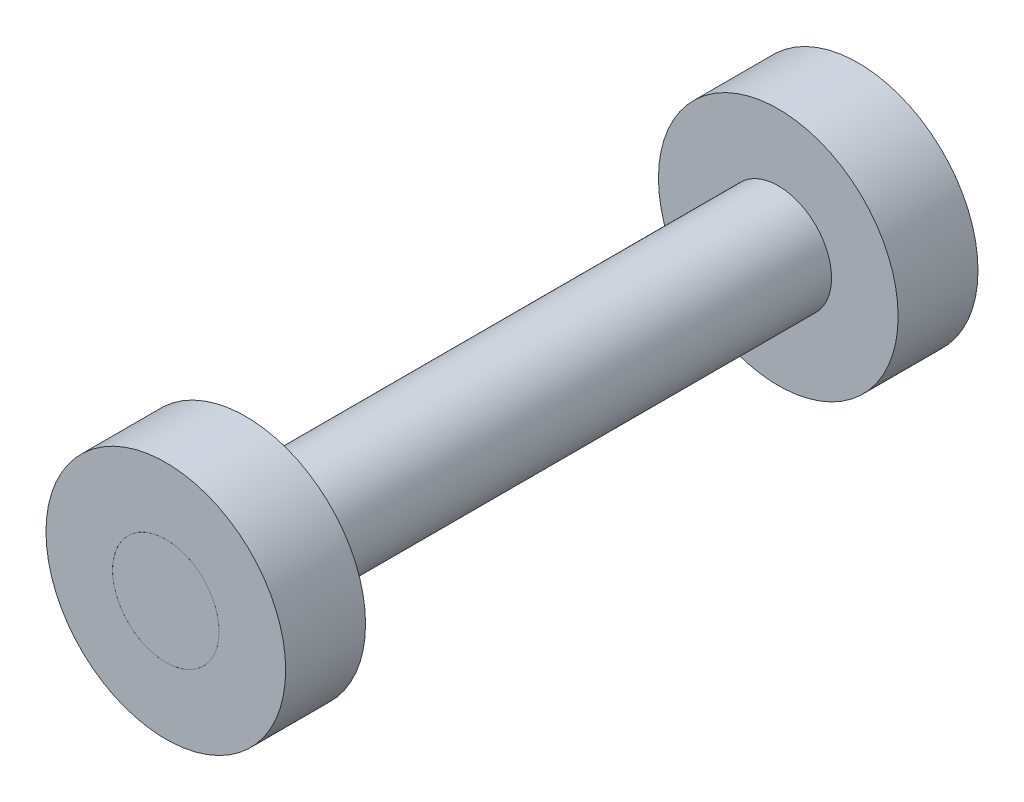
ISO-10303-21;
HEADER;
FILE_DESCRIPTION(('STEP AP214'),'2;1');
FILE_NAME('part.step','',(''),(''),'','','');
FILE_SCHEMA(('AUTOMOTIVE_DESIGN { 1 0 10303 214 1 1 1 1 }'));
ENDSEC;
DATA;
#1=APPLICATION_CONTEXT('core data for automotive mechanical design processes');
#2=APPLICATION_PROTOCOL_DEFINITION('international standard','automotive_design',2000,#1);
#3=PRODUCT_CONTEXT('',#1,'mechanical');
#4=PRODUCT('Part','Part','',(#3));
#5=PRODUCT_RELATED_PRODUCT_CATEGORY('part','',(#4));
#6=PRODUCT_DEFINITION_FORMATION('','',#4);
#7=PRODUCT_DEFINITION_CONTEXT('part definition',#1,'design');
#8=PRODUCT_DEFINITION('design','',#6,#7);
#9=PRODUCT_DEFINITION_SHAPE('','',#8);
#10=(LENGTH_UNIT() NAMED_UNIT(*) SI_UNIT(.MILLI.,.METRE.));
#11=(NAMED_UNIT(*) PLANE_ANGLE_UNIT() SI_UNIT($,.RADIAN.));
#12=(NAMED_UNIT(*) SI_UNIT($,.STERADIAN.) SOLID_ANGLE_UNIT());
#13=UNCERTAINTY_MEASURE_WITH_UNIT(LENGTH_MEASURE(1.E-05),#10,'distance_accuracy_value','');
#14=(GEOMETRIC_REPRESENTATION_CONTEXT(3) GLOBAL_UNCERTAINTY_ASSIGNED_CONTEXT((#13)) GLOBAL_UNIT_ASSIGNED_CONTEXT((#10,
#11,#12)) REPRESENTATION_CONTEXT('',''));
#15=CARTESIAN_POINT('',(0.,0.,0.));
#16=DIRECTION('',(0.,0.,1.));
#17=DIRECTION('',(1.,0.,0.));
#18=AXIS2_PLACEMENT_3D('',#15,#16,#17);
#19=CARTESIAN_POINT('',(0.,0.,26.));
#20=DIRECTION('',(0.,0.,1.));
#21=DIRECTION('',(1.,0.,0.));
#22=AXIS2_PLACEMENT_3D('',#19,#20,#21);
#23=PLANE('',#22);
#24=CARTESIAN_POINT('',(0.,0.,26.));
#25=DIRECTION('',(0.,0.,1.));
#26=DIRECTION('',(1.,0.,0.));
#27=AXIS2_PLACEMENT_3D('',#24,#25,#26);
#28=CIRCLE('',#27,4.5);
#29=CARTESIAN_POINT('',(4.5,0.,26.));
#30=VERTEX_POINT('',#29);
#31=EDGE_CURVE('E11',#30,#30,#28,.T.);
#32=ORIENTED_EDGE('',*,*,#31,.T.);
#33=EDGE_LOOP('',(#32));
#34=FACE_BOUND('',#33,.T.);
#35=CARTESIAN_POINT('',(0.,0.,26.));
#36=DIRECTION('',(0.,0.,1.));
#37=DIRECTION('',(1.,0.,0.));
#38=AXIS2_PLACEMENT_3D('',#35,#36,#37);
#39=CIRCLE('',#38,2.);
#40=CARTESIAN_POINT('',(2.,0.,26.));
#41=VERTEX_POINT('',#40);
#42=EDGE_CURVE('E56',#41,#41,#39,.T.);
#43=ORIENTED_EDGE('',*,*,#42,.F.);
#44=EDGE_LOOP('',(#43));
#45=FACE_BOUND('',#44,.T.);
#46=ADVANCED_FACE('F45',(#34,#45),#23,.T.);
#47=CARTESIAN_POINT('',(0.,0.,23.));
#48=DIRECTION('',(0.,0.,1.));
#49=DIRECTION('',(1.,0.,0.));
#50=AXIS2_PLACEMENT_3D('',#47,#48,#49);
#51=PLANE('',#50);
#52=CARTESIAN_POINT('',(0.,0.,23.));
#53=DIRECTION('',(0.,0.,1.));
#54=DIRECTION('',(1.,0.,0.));
#55=AXIS2_PLACEMENT_3D('',#52,#53,#54);
#56=CIRCLE('',#55,4.5);
#57=CARTESIAN_POINT('',(4.5,0.,23.));
#58=VERTEX_POINT('',#57);
#59=EDGE_CURVE('E49',#58,#58,#56,.T.);
#60=ORIENTED_EDGE('',*,*,#59,.F.);
#61=EDGE_LOOP('',(#60));
#62=FACE_BOUND('',#61,.T.);
#63=CARTESIAN_POINT('',(0.,0.,23.));
#64=DIRECTION('',(0.,0.,1.));
#65=DIRECTION('',(1.,0.,0.));
#66=AXIS2_PLACEMENT_3D('',#63,#64,#65);
#67=CIRCLE('',#66,2.);
#68=CARTESIAN_POINT('',(2.,0.,23.));
#69=VERTEX_POINT('',#68);
#70=EDGE_CURVE('E58',#69,#69,#67,.T.);
#71=ORIENTED_EDGE('',*,*,#70,.T.);
#72=EDGE_LOOP('',(#71));
#73=FACE_BOUND('',#72,.T.);
#74=ADVANCED_FACE('F68',(#62,#73),#51,.F.);
#75=CARTESIAN_POINT('',(0.,0.,26.));
#76=DIRECTION('',(0.,0.,-1.));
#77=DIRECTION('',(-1.,0.,0.));
#78=AXIS2_PLACEMENT_3D('',#75,#76,#77);
#79=CYLINDRICAL_SURFACE('',#78,4.5);
#80=ORIENTED_EDGE('',*,*,#31,.F.);
#81=EDGE_LOOP('',(#80));
#82=FACE_BOUND('',#81,.T.);
#83=ORIENTED_EDGE('',*,*,#59,.T.);
#84=EDGE_LOOP('',(#83));
#85=FACE_BOUND('',#84,.T.);
#86=ADVANCED_FACE('F47',(#82,#85),#79,.T.);
#87=CARTESIAN_POINT('',(0.,0.,26.));
#88=DIRECTION('',(0.,0.,-1.));
#89=DIRECTION('',(-1.,0.,0.));
#90=AXIS2_PLACEMENT_3D('',#87,#88,#89);
#91=CYLINDRICAL_SURFACE('',#90,2.);
#92=ORIENTED_EDGE('',*,*,#42,.T.);
#93=EDGE_LOOP('',(#92));
#94=FACE_BOUND('',#93,.T.);
#95=ORIENTED_EDGE('',*,*,#70,.F.);
#96=EDGE_LOOP('',(#95));
#97=FACE_BOUND('',#96,.T.);
#98=ADVANCED_FACE('F64',(#94,#97),#91,.F.);
#99=CLOSED_SHELL('',(#46,#74,#86,#98));
#100=MANIFOLD_SOLID_BREP('B2',#99);
#101=CARTESIAN_POINT('',(0.,0.,3.));
#102=DIRECTION('',(0.,0.,-1.));
#103=DIRECTION('',(-1.,0.,0.));
#104=AXIS2_PLACEMENT_3D('',#101,#102,#103);
#105=CYLINDRICAL_SURFACE('',#104,4.5);
#106=CARTESIAN_POINT('',(0.,0.,3.));
#107=DIRECTION('',(0.,0.,1.));
#108=DIRECTION('',(1.,0.,0.));
#109=AXIS2_PLACEMENT_3D('',#106,#107,#108);
#110=CIRCLE('',#109,4.5);
#111=CARTESIAN_POINT('',(4.5,0.,3.));
#112=VERTEX_POINT('',#111);
#113=EDGE_CURVE('E44',#112,#112,#110,.T.);
#114=ORIENTED_EDGE('',*,*,#113,.F.);
#115=EDGE_LOOP('',(#114));
#116=FACE_BOUND('',#115,.T.);
#117=CARTESIAN_POINT('',(0.,0.,0.));
#118=DIRECTION('',(0.,0.,1.));
#119=DIRECTION('',(1.,0.,0.));
#120=AXIS2_PLACEMENT_3D('',#117,#118,#119);
#121=CIRCLE('',#120,4.5);
#122=CARTESIAN_POINT('',(4.5,0.,0.));
#123=VERTEX_POINT('',#122);
#124=EDGE_CURVE('E110',#123,#123,#121,.T.);
#125=ORIENTED_EDGE('',*,*,#124,.T.);
#126=EDGE_LOOP('',(#125));
#127=FACE_BOUND('',#126,.T.);
#128=ADVANCED_FACE('F107',(#116,#127),#105,.T.);
#129=CARTESIAN_POINT('',(0.,0.,3.));
#130=DIRECTION('',(0.,0.,1.));
#131=DIRECTION('',(1.,0.,0.));
#132=AXIS2_PLACEMENT_3D('',#129,#130,#131);
#133=PLANE('',#132);
#134=CARTESIAN_POINT('',(0.,0.,3.));
#135=DIRECTION('',(0.,0.,1.));
#136=DIRECTION('',(1.,0.,0.));
#137=AXIS2_PLACEMENT_3D('',#134,#135,#136);
#138=CIRCLE('',#137,2.);
#139=CARTESIAN_POINT('',(-2.,0.,3.));
#140=VERTEX_POINT('',#139);
#141=EDGE_CURVE('E119',#140,#140,#138,.F.);
#142=ORIENTED_EDGE('',*,*,#141,.T.);
#143=EDGE_LOOP('',(#142));
#144=FACE_BOUND('',#143,.T.);
#145=ORIENTED_EDGE('',*,*,#113,.T.);
#146=EDGE_LOOP('',(#145));
#147=FACE_BOUND('',#146,.T.);
#148=ADVANCED_FACE('F141',(#144,#147),#133,.T.);
#149=CARTESIAN_POINT('',(0.,0.,0.));
#150=DIRECTION('',(0.,0.,1.));
#151=DIRECTION('',(1.,0.,0.));
#152=AXIS2_PLACEMENT_3D('',#149,#150,#151);
#153=PLANE('',#152);
#154=ORIENTED_EDGE('',*,*,#124,.F.);
#155=EDGE_LOOP('',(#154));
#156=FACE_BOUND('',#155,.T.);
#157=ADVANCED_FACE('F133',(#156),#153,.F.);
#158=CARTESIAN_POINT('',(0.,0.,26.));
#159=DIRECTION('',(0.,0.,-1.));
#160=DIRECTION('',(-1.,0.,0.));
#161=AXIS2_PLACEMENT_3D('',#158,#159,#160);
#162=CYLINDRICAL_SURFACE('',#161,2.);
#163=CARTESIAN_POINT('',(0.,0.,26.));
#164=DIRECTION('',(0.,0.,1.));
#165=DIRECTION('',(1.,0.,0.));
#166=AXIS2_PLACEMENT_3D('',#163,#164,#165);
#167=CIRCLE('',#166,2.);
#168=CARTESIAN_POINT('',(-2.,0.,26.));
#169=VERTEX_POINT('',#168);
#170=EDGE_CURVE('E124',#169,#169,#167,.T.);
#171=CARTESIAN_POINT('',(-2.,0.,3.));
#172=CARTESIAN_POINT('',(-2.,0.,3.23958333333333));
#173=CARTESIAN_POINT('',(-2.,0.,3.47916666666666));
#174=CARTESIAN_POINT('',(-2.,0.,3.95833333333333));
#175=CARTESIAN_POINT('',(-2.,0.,4.19791666666666));
#176=CARTESIAN_POINT('',(-2.,0.,4.67708333333333));
#177=CARTESIAN_POINT('',(-2.,0.,4.91666666666666));
#178=CARTESIAN_POINT('',(-2.,0.,5.39583333333333));
#179=CARTESIAN_POINT('',(-2.,0.,5.63541666666666));
#180=CARTESIAN_POINT('',(-2.,0.,6.11458333333333));
#181=CARTESIAN_POINT('',(-2.,0.,6.35416666666666));
#182=CARTESIAN_POINT('',(-2.,0.,6.83333333333333));
#183=CARTESIAN_POINT('',(-2.,0.,7.07291666666666));
#184=CARTESIAN_POINT('',(-2.,0.,7.55208333333333));
#185=CARTESIAN_POINT('',(-2.,0.,7.79166666666666));
#186=CARTESIAN_POINT('',(-2.,0.,8.27083333333333));
#187=CARTESIAN_POINT('',(-2.,0.,8.51041666666666));
#188=CARTESIAN_POINT('',(-2.,0.,8.98958333333333));
#189=CARTESIAN_POINT('',(-2.,0.,9.22916666666666));
#190=CARTESIAN_POINT('',(-2.,0.,9.70833333333333));
#191=CARTESIAN_POINT('',(-2.,0.,9.94791666666667));
#192=CARTESIAN_POINT('',(-2.,0.,10.4270833333333));
#193=CARTESIAN_POINT('',(-2.,0.,10.6666666666667));
#194=CARTESIAN_POINT('',(-2.,0.,11.1458333333333));
#195=CARTESIAN_POINT('',(-2.,0.,11.3854166666667));
#196=CARTESIAN_POINT('',(-2.,0.,11.8645833333333));
#197=CARTESIAN_POINT('',(-2.,0.,12.1041666666667));
#198=CARTESIAN_POINT('',(-2.,0.,12.5833333333333));
#199=CARTESIAN_POINT('',(-2.,0.,12.8229166666667));
#200=CARTESIAN_POINT('',(-2.,0.,13.3020833333333));
#201=CARTESIAN_POINT('',(-2.,0.,13.5416666666667));
#202=CARTESIAN_POINT('',(-2.,0.,14.0208333333333));
#203=CARTESIAN_POINT('',(-2.,0.,14.2604166666667));
#204=CARTESIAN_POINT('',(-2.,0.,14.7395833333333));
#205=CARTESIAN_POINT('',(-2.,0.,14.9791666666667));
#206=CARTESIAN_POINT('',(-2.,0.,15.4583333333333));
#207=CARTESIAN_POINT('',(-2.,0.,15.6979166666667));
#208=CARTESIAN_POINT('',(-2.,0.,16.1770833333333));
#209=CARTESIAN_POINT('',(-2.,0.,16.4166666666667));
#210=CARTESIAN_POINT('',(-2.,0.,16.8958333333333));
#211=CARTESIAN_POINT('',(-2.,0.,17.1354166666667));
#212=CARTESIAN_POINT('',(-2.,0.,17.6145833333333));
#213=CARTESIAN_POINT('',(-2.,0.,17.8541666666667));
#214=CARTESIAN_POINT('',(-2.,0.,18.3333333333333));
#215=CARTESIAN_POINT('',(-2.,0.,18.5729166666667));
#216=CARTESIAN_POINT('',(-2.,0.,19.0520833333333));
#217=CARTESIAN_POINT('',(-2.,0.,19.2916666666667));
#218=CARTESIAN_POINT('',(-2.,0.,19.7708333333333));
#219=CARTESIAN_POINT('',(-2.,0.,20.0104166666667));
#220=CARTESIAN_POINT('',(-2.,0.,20.4895833333333));
#221=CARTESIAN_POINT('',(-2.,0.,20.7291666666667));
#222=CARTESIAN_POINT('',(-2.,0.,21.2083333333333));
#223=CARTESIAN_POINT('',(-2.,0.,21.4479166666667));
#224=CARTESIAN_POINT('',(-2.,0.,21.9270833333333));
#225=CARTESIAN_POINT('',(-2.,0.,22.1666666666667));
#226=CARTESIAN_POINT('',(-2.,0.,22.6458333333333));
#227=CARTESIAN_POINT('',(-2.,0.,22.8854166666667));
#228=CARTESIAN_POINT('',(-2.,0.,23.3645833333333));
#229=CARTESIAN_POINT('',(-2.,0.,23.6041666666667));
#230=CARTESIAN_POINT('',(-2.,0.,24.0833333333333));
#231=CARTESIAN_POINT('',(-2.,0.,24.3229166666667));
#232=CARTESIAN_POINT('',(-2.,0.,24.8020833333333));
#233=CARTESIAN_POINT('',(-2.,0.,25.0416666666667));
#234=CARTESIAN_POINT('',(-2.,0.,25.5208333333333));
#235=CARTESIAN_POINT('',(-2.,0.,25.7604166666667));
#236=CARTESIAN_POINT('',(-2.,0.,26.));
#237=B_SPLINE_CURVE_WITH_KNOTS('',3,(#171,#172,#173,#174,#175,#176,#177,#178,#179,#180,#181,
#182,#183,#184,#185,#186,#187,#188,#189,#190,#191,#192,#193,#194,#195,#196,#197,#198,#199,#200,
#201,#202,#203,#204,#205,#206,#207,#208,#209,#210,#211,#212,#213,#214,#215,#216,#217,#218,#219,
#220,#221,#222,#223,#224,#225,#226,#227,#228,#229,#230,#231,#232,#233,#234,#235,#236),
.UNSPECIFIED.,.F.,.F.,(4,2,2,2,2,2,2,2,2,2,2,2,2,2,2,2,2,2,2,2,2,2,2,2,2,2,2,2,2,2,2,2,4),(0.,
0.718750000000001,1.4375,2.15625,2.875,3.59375,4.3125,5.03125,5.75,6.46875,7.1875,7.90625,8.625,
9.34375,10.0625,10.78125,11.5,12.21875,12.9375,13.65625,14.375,15.09375,15.8125,16.53125,17.25,
17.96875,18.6875,19.40625,20.125,20.84375,21.5625,22.28125,23.),.UNSPECIFIED.);
#238=EDGE_CURVE('BSEAM131',#140,#169,#237,.T.);
#239=ORIENTED_EDGE('',*,*,#141,.F.);
#240=ORIENTED_EDGE('',*,*,#170,.F.);
#241=ORIENTED_EDGE('',*,*,#238,.T.);
#242=ORIENTED_EDGE('',*,*,#238,.F.);
#243=EDGE_LOOP('',(#239,#241,#240,#242));
#244=FACE_BOUND('',#243,.T.);
#245=ADVANCED_FACE('F131',(#244),#162,.T.);
#246=CARTESIAN_POINT('',(0.,0.,26.));
#247=DIRECTION('',(0.,0.,1.));
#248=DIRECTION('',(1.,0.,0.));
#249=AXIS2_PLACEMENT_3D('',#246,#247,#248);
#250=PLANE('',#249);
#251=ORIENTED_EDGE('',*,*,#170,.T.);
#252=EDGE_LOOP('',(#251));
#253=FACE_BOUND('',#252,.T.);
#254=ADVANCED_FACE('F129',(#253),#250,.T.);
#255=CLOSED_SHELL('',(#128,#148,#157,#245,#254));
#256=MANIFOLD_SOLID_BREP('B6',#255);
#257=ADVANCED_BREP_SHAPE_REPRESENTATION('',(#18,#100,#256),#14);
#258=SHAPE_DEFINITION_REPRESENTATION(#9,#257);
ENDSEC;
END-ISO-10303-21;
